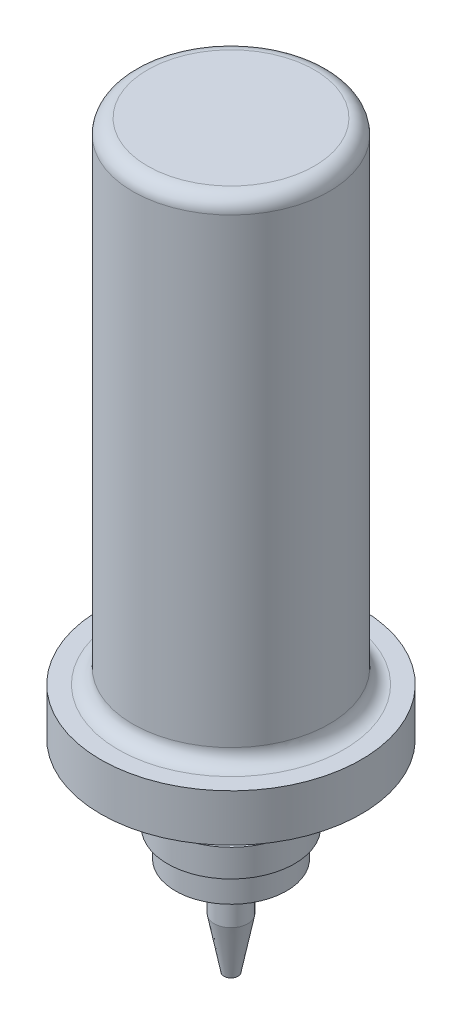
ISO-10303-21;
HEADER;
FILE_DESCRIPTION(('STEP AP214'),'2;1');
FILE_NAME('part.step','',(''),(''),'','','');
FILE_SCHEMA(('AUTOMOTIVE_DESIGN { 1 0 10303 214 1 1 1 1 }'));
ENDSEC;
DATA;
#1=APPLICATION_CONTEXT('core data for automotive mechanical design processes');
#2=APPLICATION_PROTOCOL_DEFINITION('international standard','automotive_design',2000,#1);
#3=PRODUCT_CONTEXT('',#1,'mechanical');
#4=PRODUCT('Part','Part','',(#3));
#5=PRODUCT_RELATED_PRODUCT_CATEGORY('part','',(#4));
#6=PRODUCT_DEFINITION_FORMATION('','',#4);
#7=PRODUCT_DEFINITION_CONTEXT('part definition',#1,'design');
#8=PRODUCT_DEFINITION('design','',#6,#7);
#9=PRODUCT_DEFINITION_SHAPE('','',#8);
#10=(LENGTH_UNIT() NAMED_UNIT(*) SI_UNIT(.MILLI.,.METRE.));
#11=(NAMED_UNIT(*) PLANE_ANGLE_UNIT() SI_UNIT($,.RADIAN.));
#12=(NAMED_UNIT(*) SI_UNIT($,.STERADIAN.) SOLID_ANGLE_UNIT());
#13=UNCERTAINTY_MEASURE_WITH_UNIT(LENGTH_MEASURE(1.E-05),#10,'distance_accuracy_value','');
#14=(GEOMETRIC_REPRESENTATION_CONTEXT(3) GLOBAL_UNCERTAINTY_ASSIGNED_CONTEXT((#13)) GLOBAL_UNIT_ASSIGNED_CONTEXT((#10,
#11,#12)) REPRESENTATION_CONTEXT('',''));
#15=CARTESIAN_POINT('',(0.,0.,0.));
#16=DIRECTION('',(0.,0.,1.));
#17=DIRECTION('',(1.,0.,0.));
#18=AXIS2_PLACEMENT_3D('',#15,#16,#17);
#19=CARTESIAN_POINT('',(0.,-50.,0.));
#20=DIRECTION('',(0.,1.,0.));
#21=DIRECTION('',(0.,0.,1.));
#22=AXIS2_PLACEMENT_3D('',#19,#20,#21);
#23=CYLINDRICAL_SURFACE('',#22,10.00174333);
#24=CARTESIAN_POINT('',(0.,-1.5,0.));
#25=DIRECTION('',(0.,1.,0.));
#26=DIRECTION('',(0.,0.,1.));
#27=AXIS2_PLACEMENT_3D('',#24,#25,#26);
#28=CIRCLE('',#27,10.00174333);
#29=CARTESIAN_POINT('',(0.,-1.5,10.00174333));
#30=VERTEX_POINT('',#29);
#31=EDGE_CURVE('E48',#30,#30,#28,.F.);
#32=ORIENTED_EDGE('',*,*,#31,.T.);
#33=EDGE_LOOP('',(#32));
#34=FACE_BOUND('',#33,.T.);
#35=CARTESIAN_POINT('',(0.,-48.5,0.));
#36=DIRECTION('',(0.,-1.,0.));
#37=DIRECTION('',(0.,0.,-1.));
#38=AXIS2_PLACEMENT_3D('',#35,#36,#37);
#39=CIRCLE('',#38,10.00174333);
#40=CARTESIAN_POINT('',(0.,-48.5,-10.00174333));
#41=VERTEX_POINT('',#40);
#42=EDGE_CURVE('E53',#41,#41,#39,.F.);
#43=ORIENTED_EDGE('',*,*,#42,.T.);
#44=EDGE_LOOP('',(#43));
#45=FACE_BOUND('',#44,.T.);
#46=ADVANCED_FACE('F33',(#34,#45),#23,.T.);
#47=CARTESIAN_POINT('',(0.,0.,0.));
#48=DIRECTION('',(0.,1.,0.));
#49=DIRECTION('',(0.,0.,1.));
#50=AXIS2_PLACEMENT_3D('',#47,#48,#49);
#51=PLANE('',#50);
#52=CARTESIAN_POINT('',(0.,0.,0.));
#53=DIRECTION('',(0.,1.,0.));
#54=DIRECTION('',(0.,0.,1.));
#55=AXIS2_PLACEMENT_3D('',#52,#53,#54);
#56=CIRCLE('',#55,8.50174333);
#57=CARTESIAN_POINT('',(0.,0.,8.50174333));
#58=VERTEX_POINT('',#57);
#59=EDGE_CURVE('E56',#58,#58,#56,.T.);
#60=ORIENTED_EDGE('',*,*,#59,.T.);
#61=EDGE_LOOP('',(#60));
#62=FACE_BOUND('',#61,.T.);
#63=ADVANCED_FACE('F121',(#62),#51,.T.);
#64=CARTESIAN_POINT('',(0.,-54.8,0.));
#65=DIRECTION('',(0.,1.,0.));
#66=DIRECTION('',(0.,0.,1.));
#67=AXIS2_PLACEMENT_3D('',#64,#65,#66);
#68=CYLINDRICAL_SURFACE('',#67,13.27917762);
#69=CARTESIAN_POINT('',(0.,-54.8,0.));
#70=DIRECTION('',(0.,-1.,0.));
#71=DIRECTION('',(0.,0.,-1.));
#72=AXIS2_PLACEMENT_3D('',#69,#70,#71);
#73=CIRCLE('',#72,13.27917762);
#74=CARTESIAN_POINT('',(0.,-54.8,-13.27917762));
#75=VERTEX_POINT('',#74);
#76=EDGE_CURVE('E59',#75,#75,#73,.T.);
#77=ORIENTED_EDGE('',*,*,#76,.F.);
#78=EDGE_LOOP('',(#77));
#79=FACE_BOUND('',#78,.T.);
#80=CARTESIAN_POINT('',(0.,-50.,0.));
#81=DIRECTION('',(0.,-1.,0.));
#82=DIRECTION('',(0.,0.,-1.));
#83=AXIS2_PLACEMENT_3D('',#80,#81,#82);
#84=CIRCLE('',#83,13.27917762);
#85=CARTESIAN_POINT('',(0.,-50.,-13.27917762));
#86=VERTEX_POINT('',#85);
#87=EDGE_CURVE('E60',#86,#86,#84,.T.);
#88=ORIENTED_EDGE('',*,*,#87,.T.);
#89=EDGE_LOOP('',(#88));
#90=FACE_BOUND('',#89,.T.);
#91=ADVANCED_FACE('F127',(#79,#90),#68,.T.);
#92=CARTESIAN_POINT('',(0.,-54.8,0.));
#93=DIRECTION('',(0.,-1.,0.));
#94=DIRECTION('',(0.,0.,-1.));
#95=AXIS2_PLACEMENT_3D('',#92,#93,#94);
#96=PLANE('',#95);
#97=CARTESIAN_POINT('',(0.,-54.8,0.));
#98=DIRECTION('',(0.,-1.,0.));
#99=DIRECTION('',(0.,0.,-1.));
#100=AXIS2_PLACEMENT_3D('',#97,#98,#99);
#101=CIRCLE('',#100,5.29097481651185);
#102=CARTESIAN_POINT('',(0.,-54.8,-5.29097481651185));
#103=VERTEX_POINT('',#102);
#104=EDGE_CURVE('E66',#103,#103,#101,.T.);
#105=ORIENTED_EDGE('',*,*,#104,.F.);
#106=EDGE_LOOP('',(#105));
#107=FACE_BOUND('',#106,.T.);
#108=ORIENTED_EDGE('',*,*,#76,.T.);
#109=EDGE_LOOP('',(#108));
#110=FACE_BOUND('',#109,.T.);
#111=ADVANCED_FACE('F151',(#107,#110),#96,.T.);
#112=CARTESIAN_POINT('',(0.,-50.,0.));
#113=DIRECTION('',(0.,-1.,0.));
#114=DIRECTION('',(0.,0.,-1.));
#115=AXIS2_PLACEMENT_3D('',#112,#113,#114);
#116=PLANE('',#115);
#117=CARTESIAN_POINT('',(0.,-50.,0.));
#118=DIRECTION('',(0.,-1.,0.));
#119=DIRECTION('',(0.,0.,-1.));
#120=AXIS2_PLACEMENT_3D('',#117,#118,#119);
#121=CIRCLE('',#120,11.50174333);
#122=CARTESIAN_POINT('',(0.,-50.,-11.50174333));
#123=VERTEX_POINT('',#122);
#124=EDGE_CURVE('E44',#123,#123,#121,.T.);
#125=ORIENTED_EDGE('',*,*,#124,.T.);
#126=EDGE_LOOP('',(#125));
#127=FACE_BOUND('',#126,.T.);
#128=ORIENTED_EDGE('',*,*,#87,.F.);
#129=EDGE_LOOP('',(#128));
#130=FACE_BOUND('',#129,.T.);
#131=ADVANCED_FACE('F136',(#127,#130),#116,.F.);
#132=CARTESIAN_POINT('',(0.,-1.5,0.));
#133=DIRECTION('',(0.,1.,0.));
#134=DIRECTION('',(0.,0.,1.));
#135=AXIS2_PLACEMENT_3D('',#132,#133,#134);
#136=TOROIDAL_SURFACE('',#135,8.50174333,1.5);
#137=ORIENTED_EDGE('',*,*,#31,.F.);
#138=EDGE_LOOP('',(#137));
#139=FACE_BOUND('',#138,.T.);
#140=ORIENTED_EDGE('',*,*,#59,.F.);
#141=EDGE_LOOP('',(#140));
#142=FACE_BOUND('',#141,.T.);
#143=ADVANCED_FACE('F133',(#139,#142),#136,.T.);
#144=CARTESIAN_POINT('',(0.,-48.5,0.));
#145=DIRECTION('',(0.,-1.,0.));
#146=DIRECTION('',(0.,0.,-1.));
#147=AXIS2_PLACEMENT_3D('',#144,#145,#146);
#148=TOROIDAL_SURFACE('',#147,11.50174333,1.5);
#149=ORIENTED_EDGE('',*,*,#124,.F.);
#150=EDGE_LOOP('',(#149));
#151=FACE_BOUND('',#150,.T.);
#152=ORIENTED_EDGE('',*,*,#42,.F.);
#153=EDGE_LOOP('',(#152));
#154=FACE_BOUND('',#153,.T.);
#155=ADVANCED_FACE('F135',(#151,#154),#148,.F.);
#156=CARTESIAN_POINT('',(0.,-59.8,0.));
#157=DIRECTION('',(0.,1.,0.));
#158=DIRECTION('',(0.,0.,1.));
#159=AXIS2_PLACEMENT_3D('',#156,#157,#158);
#160=CYLINDRICAL_SURFACE('',#159,5.29097481651185);
#161=CARTESIAN_POINT('',(0.,-59.8,0.));
#162=DIRECTION('',(0.,-1.,0.));
#163=DIRECTION('',(0.,0.,-1.));
#164=AXIS2_PLACEMENT_3D('',#161,#162,#163);
#165=CIRCLE('',#164,5.29097481651185);
#166=CARTESIAN_POINT('',(0.,-59.8,-5.29097481651185));
#167=VERTEX_POINT('',#166);
#168=EDGE_CURVE('E63',#167,#167,#165,.T.);
#169=ORIENTED_EDGE('',*,*,#168,.F.);
#170=EDGE_LOOP('',(#169));
#171=FACE_BOUND('',#170,.T.);
#172=ORIENTED_EDGE('',*,*,#104,.T.);
#173=EDGE_LOOP('',(#172));
#174=FACE_BOUND('',#173,.T.);
#175=ADVANCED_FACE('F111',(#171,#174),#160,.T.);
#176=CARTESIAN_POINT('',(0.,-62.6,0.));
#177=DIRECTION('',(0.,1.,0.));
#178=DIRECTION('',(0.,0.,1.));
#179=AXIS2_PLACEMENT_3D('',#176,#177,#178);
#180=CYLINDRICAL_SURFACE('',#179,6.46621165118291);
#181=CARTESIAN_POINT('',(0.,-62.6,0.));
#182=DIRECTION('',(0.,-1.,0.));
#183=DIRECTION('',(0.,0.,-1.));
#184=AXIS2_PLACEMENT_3D('',#181,#182,#183);
#185=CIRCLE('',#184,6.46621165118291);
#186=CARTESIAN_POINT('',(0.,-62.6,-6.46621165118291));
#187=VERTEX_POINT('',#186);
#188=EDGE_CURVE('E69',#187,#187,#185,.T.);
#189=ORIENTED_EDGE('',*,*,#188,.F.);
#190=EDGE_LOOP('',(#189));
#191=FACE_BOUND('',#190,.T.);
#192=CARTESIAN_POINT('',(0.,-59.8,0.));
#193=DIRECTION('',(0.,-1.,0.));
#194=DIRECTION('',(0.,0.,-1.));
#195=AXIS2_PLACEMENT_3D('',#192,#193,#194);
#196=CIRCLE('',#195,6.46621165118291);
#197=CARTESIAN_POINT('',(0.,-59.8,-6.46621165118291));
#198=VERTEX_POINT('',#197);
#199=EDGE_CURVE('E72',#198,#198,#196,.T.);
#200=ORIENTED_EDGE('',*,*,#199,.T.);
#201=EDGE_LOOP('',(#200));
#202=FACE_BOUND('',#201,.T.);
#203=ADVANCED_FACE('F105',(#191,#202),#180,.T.);
#204=CARTESIAN_POINT('',(0.,-62.6,0.));
#205=DIRECTION('',(0.,-1.,0.));
#206=DIRECTION('',(0.,0.,-1.));
#207=AXIS2_PLACEMENT_3D('',#204,#205,#206);
#208=PLANE('',#207);
#209=CARTESIAN_POINT('',(0.,-62.6,0.));
#210=DIRECTION('',(0.,-1.,0.));
#211=DIRECTION('',(0.,0.,-1.));
#212=AXIS2_PLACEMENT_3D('',#209,#210,#211);
#213=CIRCLE('',#212,5.65928400812565);
#214=CARTESIAN_POINT('',(0.,-62.6,-5.65928400812565));
#215=VERTEX_POINT('',#214);
#216=EDGE_CURVE('E78',#215,#215,#213,.T.);
#217=ORIENTED_EDGE('',*,*,#216,.F.);
#218=EDGE_LOOP('',(#217));
#219=FACE_BOUND('',#218,.T.);
#220=ORIENTED_EDGE('',*,*,#188,.T.);
#221=EDGE_LOOP('',(#220));
#222=FACE_BOUND('',#221,.T.);
#223=ADVANCED_FACE('F102',(#219,#222),#208,.T.);
#224=CARTESIAN_POINT('',(0.,-59.8,0.));
#225=DIRECTION('',(0.,-1.,0.));
#226=DIRECTION('',(0.,0.,-1.));
#227=AXIS2_PLACEMENT_3D('',#224,#225,#226);
#228=PLANE('',#227);
#229=ORIENTED_EDGE('',*,*,#168,.T.);
#230=EDGE_LOOP('',(#229));
#231=FACE_BOUND('',#230,.T.);
#232=ORIENTED_EDGE('',*,*,#199,.F.);
#233=EDGE_LOOP('',(#232));
#234=FACE_BOUND('',#233,.T.);
#235=ADVANCED_FACE('F98',(#231,#234),#228,.F.);
#236=CARTESIAN_POINT('',(0.,-65.4,0.));
#237=DIRECTION('',(0.,1.,0.));
#238=DIRECTION('',(0.,0.,1.));
#239=AXIS2_PLACEMENT_3D('',#236,#237,#238);
#240=CYLINDRICAL_SURFACE('',#239,5.65928400812565);
#241=CARTESIAN_POINT('',(0.,-65.4,0.));
#242=DIRECTION('',(0.,-1.,0.));
#243=DIRECTION('',(0.,0.,-1.));
#244=AXIS2_PLACEMENT_3D('',#241,#242,#243);
#245=CIRCLE('',#244,5.65928400812565);
#246=CARTESIAN_POINT('',(0.,-65.4,-5.65928400812565));
#247=VERTEX_POINT('',#246);
#248=EDGE_CURVE('E75',#247,#247,#245,.T.);
#249=ORIENTED_EDGE('',*,*,#248,.F.);
#250=EDGE_LOOP('',(#249));
#251=FACE_BOUND('',#250,.T.);
#252=ORIENTED_EDGE('',*,*,#216,.T.);
#253=EDGE_LOOP('',(#252));
#254=FACE_BOUND('',#253,.T.);
#255=ADVANCED_FACE('F92',(#251,#254),#240,.T.);
#256=CARTESIAN_POINT('',(0.,-65.4,0.));
#257=DIRECTION('',(0.,-1.,0.));
#258=DIRECTION('',(0.,0.,-1.));
#259=AXIS2_PLACEMENT_3D('',#256,#257,#258);
#260=PLANE('',#259);
#261=CARTESIAN_POINT('',(0.,-65.4,0.));
#262=DIRECTION('',(0.,-1.,0.));
#263=DIRECTION('',(0.,0.,-1.));
#264=AXIS2_PLACEMENT_3D('',#261,#262,#263);
#265=CIRCLE('',#264,1.71555786419786);
#266=CARTESIAN_POINT('',(0.,-65.4,-1.71555786419786));
#267=VERTEX_POINT('',#266);
#268=EDGE_CURVE('E81',#267,#267,#265,.T.);
#269=ORIENTED_EDGE('',*,*,#268,.F.);
#270=EDGE_LOOP('',(#269));
#271=FACE_BOUND('',#270,.T.);
#272=ORIENTED_EDGE('',*,*,#248,.T.);
#273=EDGE_LOOP('',(#272));
#274=FACE_BOUND('',#273,.T.);
#275=ADVANCED_FACE('F89',(#271,#274),#260,.T.);
#276=CARTESIAN_POINT('',(0.,-75.4,0.));
#277=DIRECTION('',(0.,1.,0.));
#278=DIRECTION('',(0.,0.,1.));
#279=AXIS2_PLACEMENT_3D('',#276,#277,#278);
#280=CYLINDRICAL_SURFACE('',#279,1.71555786419786);
#281=CARTESIAN_POINT('',(0.,-70.2554459840297,0.));
#282=DIRECTION('',(0.,-1.,0.));
#283=DIRECTION('',(0.,0.,-1.));
#284=AXIS2_PLACEMENT_3D('',#281,#282,#283);
#285=CIRCLE('',#284,1.71555786419786);
#286=CARTESIAN_POINT('',(0.,-70.2554459840297,-1.71555786419786));
#287=VERTEX_POINT('',#286);
#288=EDGE_CURVE('E11',#287,#287,#285,.F.);
#289=ORIENTED_EDGE('',*,*,#288,.T.);
#290=EDGE_LOOP('',(#289));
#291=FACE_BOUND('',#290,.T.);
#292=ORIENTED_EDGE('',*,*,#268,.T.);
#293=EDGE_LOOP('',(#292));
#294=FACE_BOUND('',#293,.T.);
#295=ADVANCED_FACE('F87',(#291,#294),#280,.T.);
#296=CARTESIAN_POINT('',(0.,-75.4,0.));
#297=DIRECTION('',(0.,-1.,0.));
#298=DIRECTION('',(0.,0.,-1.));
#299=AXIS2_PLACEMENT_3D('',#296,#297,#298);
#300=PLANE('',#299);
#301=CARTESIAN_POINT('',(0.,-75.4,0.));
#302=DIRECTION('',(0.,-1.,0.));
#303=DIRECTION('',(0.,0.,-1.));
#304=AXIS2_PLACEMENT_3D('',#301,#302,#303);
#305=CIRCLE('',#304,0.71555786419788);
#306=CARTESIAN_POINT('',(0.,-75.4,-0.71555786419788));
#307=VERTEX_POINT('',#306);
#308=EDGE_CURVE('E40',#307,#307,#305,.T.);
#309=ORIENTED_EDGE('',*,*,#308,.T.);
#310=EDGE_LOOP('',(#309));
#311=FACE_BOUND('',#310,.T.);
#312=ADVANCED_FACE('F220',(#311),#300,.T.);
#313=CARTESIAN_POINT('',(0.,-75.4,0.));
#314=DIRECTION('',(0.,1.,0.));
#315=DIRECTION('',(0.,0.,1.));
#316=AXIS2_PLACEMENT_3D('',#313,#314,#315);
#317=CONICAL_SURFACE('',#316,0.71555786419788,0.191986217719374);
#318=ORIENTED_EDGE('',*,*,#288,.F.);
#319=EDGE_LOOP('',(#318));
#320=FACE_BOUND('',#319,.T.);
#321=ORIENTED_EDGE('',*,*,#308,.F.);
#322=EDGE_LOOP('',(#321));
#323=FACE_BOUND('',#322,.T.);
#324=ADVANCED_FACE('F35',(#320,#323),#317,.T.);
#325=CLOSED_SHELL('',(#46,#63,#91,#111,#131,#143,#155,#175,#203,#223,#235,#255,#275,#295,#312,#324));
#326=MANIFOLD_SOLID_BREP('B2',#325);
#327=ADVANCED_BREP_SHAPE_REPRESENTATION('',(#18,#326),#14);
#328=SHAPE_DEFINITION_REPRESENTATION(#9,#327);
ENDSEC;
END-ISO-10303-21;
